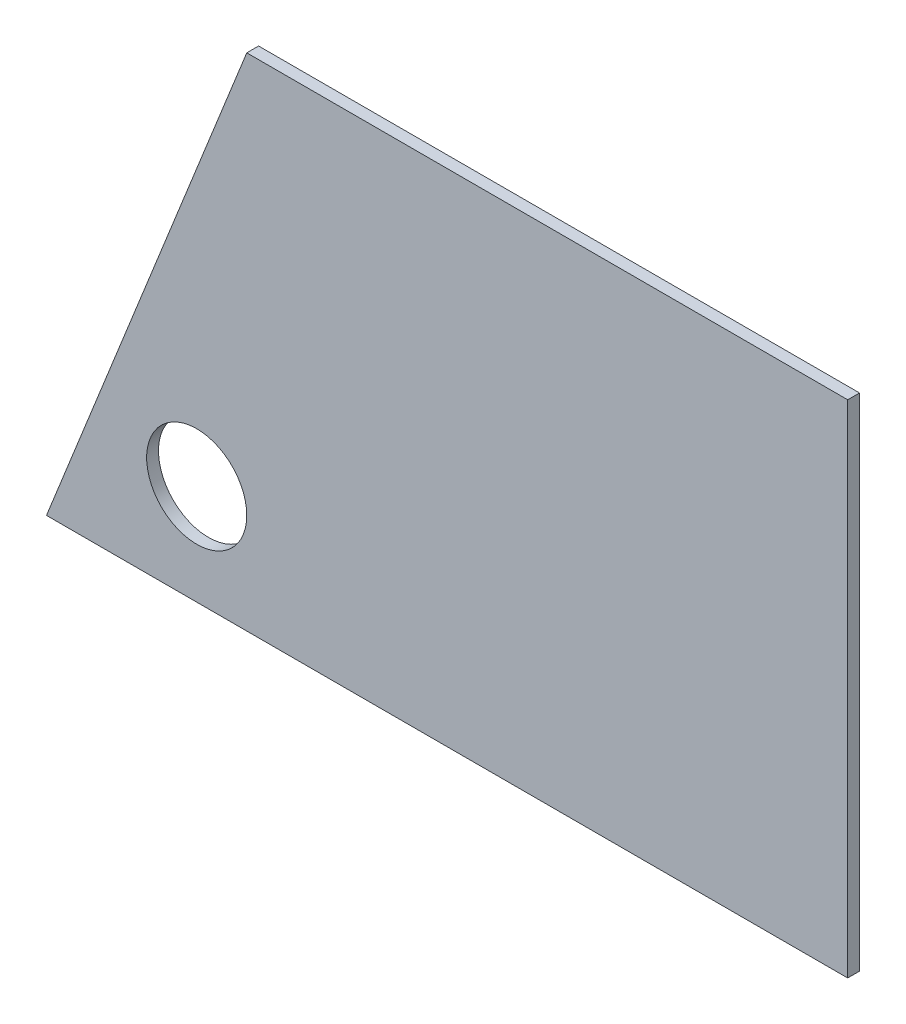
ISO-10303-21;
HEADER;
FILE_DESCRIPTION(('STEP AP214'),'2;1');
FILE_NAME('part.step','',(''),(''),'','','');
FILE_SCHEMA(('AUTOMOTIVE_DESIGN { 1 0 10303 214 1 1 1 1 }'));
ENDSEC;
DATA;
#1=APPLICATION_CONTEXT('core data for automotive mechanical design processes');
#2=APPLICATION_PROTOCOL_DEFINITION('international standard','automotive_design',2000,#1);
#3=PRODUCT_CONTEXT('',#1,'mechanical');
#4=PRODUCT('Part','Part','',(#3));
#5=PRODUCT_RELATED_PRODUCT_CATEGORY('part','',(#4));
#6=PRODUCT_DEFINITION_FORMATION('','',#4);
#7=PRODUCT_DEFINITION_CONTEXT('part definition',#1,'design');
#8=PRODUCT_DEFINITION('design','',#6,#7);
#9=PRODUCT_DEFINITION_SHAPE('','',#8);
#10=(LENGTH_UNIT() NAMED_UNIT(*) SI_UNIT(.MILLI.,.METRE.));
#11=(NAMED_UNIT(*) PLANE_ANGLE_UNIT() SI_UNIT($,.RADIAN.));
#12=(NAMED_UNIT(*) SI_UNIT($,.STERADIAN.) SOLID_ANGLE_UNIT());
#13=UNCERTAINTY_MEASURE_WITH_UNIT(LENGTH_MEASURE(1.E-05),#10,'distance_accuracy_value','');
#14=(GEOMETRIC_REPRESENTATION_CONTEXT(3) GLOBAL_UNCERTAINTY_ASSIGNED_CONTEXT((#13)) GLOBAL_UNIT_ASSIGNED_CONTEXT((#10,
#11,#12)) REPRESENTATION_CONTEXT('',''));
#15=CARTESIAN_POINT('',(0.,0.,0.));
#16=DIRECTION('',(0.,0.,1.));
#17=DIRECTION('',(1.,0.,0.));
#18=AXIS2_PLACEMENT_3D('',#15,#16,#17);
#19=CARTESIAN_POINT('',(0.,0.,3.));
#20=DIRECTION('',(0.928476690885259,-0.371390676354104,0.));
#21=DIRECTION('',(0.371390676354104,0.928476690885259,0.));
#22=AXIS2_PLACEMENT_3D('',#19,#20,#21);
#23=PLANE('',#22);
#24=DIRECTION('',(-0.371390676354104,-0.928476690885259,0.));
#25=VECTOR('',#24,1.);
#26=CARTESIAN_POINT('',(0.,0.,0.));
#27=LINE('',#26,#25);
#28=CARTESIAN_POINT('',(50.8,127.,0.));
#29=VERTEX_POINT('',#28);
#30=CARTESIAN_POINT('',(0.,0.,0.));
#31=VERTEX_POINT('',#30);
#32=EDGE_CURVE('E106',#29,#31,#27,.T.);
#33=ORIENTED_EDGE('',*,*,#32,.T.);
#34=DIRECTION('',(0.,0.,-1.));
#35=VECTOR('',#34,1.);
#36=CARTESIAN_POINT('',(0.,0.,3.));
#37=LINE('',#36,#35);
#38=CARTESIAN_POINT('',(0.,0.,3.));
#39=VERTEX_POINT('',#38);
#40=EDGE_CURVE('E11',#39,#31,#37,.T.);
#41=ORIENTED_EDGE('',*,*,#40,.F.);
#42=DIRECTION('',(-0.371390676354104,-0.928476690885259,0.));
#43=VECTOR('',#42,1.);
#44=CARTESIAN_POINT('',(0.,0.,3.));
#45=LINE('',#44,#43);
#46=CARTESIAN_POINT('',(50.8,127.,3.));
#47=VERTEX_POINT('',#46);
#48=EDGE_CURVE('E91',#47,#39,#45,.T.);
#49=ORIENTED_EDGE('',*,*,#48,.F.);
#50=DIRECTION('',(0.,0.,-1.));
#51=VECTOR('',#50,1.);
#52=CARTESIAN_POINT('',(50.8,127.,3.));
#53=LINE('',#52,#51);
#54=EDGE_CURVE('E105',#47,#29,#53,.T.);
#55=ORIENTED_EDGE('',*,*,#54,.T.);
#56=EDGE_LOOP('',(#33,#41,#49,#55));
#57=FACE_BOUND('',#56,.T.);
#58=ADVANCED_FACE('F39',(#57),#23,.F.);
#59=CARTESIAN_POINT('',(0.,0.,3.));
#60=DIRECTION('',(0.,1.,0.));
#61=DIRECTION('',(0.,0.,1.));
#62=AXIS2_PLACEMENT_3D('',#59,#60,#61);
#63=PLANE('',#62);
#64=DIRECTION('',(1.,0.,0.));
#65=VECTOR('',#64,1.);
#66=CARTESIAN_POINT('',(0.,0.,0.));
#67=LINE('',#66,#65);
#68=CARTESIAN_POINT('',(203.2,0.,0.));
#69=VERTEX_POINT('',#68);
#70=EDGE_CURVE('E95',#31,#69,#67,.T.);
#71=ORIENTED_EDGE('',*,*,#70,.T.);
#72=DIRECTION('',(0.,0.,-1.));
#73=VECTOR('',#72,1.);
#74=CARTESIAN_POINT('',(203.2,0.,3.));
#75=LINE('',#74,#73);
#76=CARTESIAN_POINT('',(203.2,0.,3.));
#77=VERTEX_POINT('',#76);
#78=EDGE_CURVE('E47',#77,#69,#75,.T.);
#79=ORIENTED_EDGE('',*,*,#78,.F.);
#80=DIRECTION('',(1.,0.,0.));
#81=VECTOR('',#80,1.);
#82=CARTESIAN_POINT('',(0.,0.,3.));
#83=LINE('',#82,#81);
#84=EDGE_CURVE('E85',#39,#77,#83,.T.);
#85=ORIENTED_EDGE('',*,*,#84,.F.);
#86=ORIENTED_EDGE('',*,*,#40,.T.);
#87=EDGE_LOOP('',(#71,#79,#85,#86));
#88=FACE_BOUND('',#87,.T.);
#89=ADVANCED_FACE('F94',(#88),#63,.F.);
#90=CARTESIAN_POINT('',(203.2,0.,3.));
#91=DIRECTION('',(-1.,0.,0.));
#92=DIRECTION('',(0.,0.,1.));
#93=AXIS2_PLACEMENT_3D('',#90,#91,#92);
#94=PLANE('',#93);
#95=DIRECTION('',(0.,1.,0.));
#96=VECTOR('',#95,1.);
#97=CARTESIAN_POINT('',(203.2,0.,0.));
#98=LINE('',#97,#96);
#99=CARTESIAN_POINT('',(203.2,127.,0.));
#100=VERTEX_POINT('',#99);
#101=EDGE_CURVE('E72',#69,#100,#98,.T.);
#102=ORIENTED_EDGE('',*,*,#101,.T.);
#103=DIRECTION('',(0.,0.,-1.));
#104=VECTOR('',#103,1.);
#105=CARTESIAN_POINT('',(203.2,127.,3.));
#106=LINE('',#105,#104);
#107=CARTESIAN_POINT('',(203.2,127.,3.));
#108=VERTEX_POINT('',#107);
#109=EDGE_CURVE('E96',#108,#100,#106,.T.);
#110=ORIENTED_EDGE('',*,*,#109,.F.);
#111=DIRECTION('',(0.,1.,0.));
#112=VECTOR('',#111,1.);
#113=CARTESIAN_POINT('',(203.2,0.,3.));
#114=LINE('',#113,#112);
#115=EDGE_CURVE('E89',#77,#108,#114,.T.);
#116=ORIENTED_EDGE('',*,*,#115,.F.);
#117=ORIENTED_EDGE('',*,*,#78,.T.);
#118=EDGE_LOOP('',(#102,#110,#116,#117));
#119=FACE_BOUND('',#118,.T.);
#120=ADVANCED_FACE('F97',(#119),#94,.F.);
#121=CARTESIAN_POINT('',(0.,127.,3.));
#122=DIRECTION('',(0.,-1.,0.));
#123=DIRECTION('',(1.,0.,0.));
#124=AXIS2_PLACEMENT_3D('',#121,#122,#123);
#125=PLANE('',#124);
#126=DIRECTION('',(-1.,0.,0.));
#127=VECTOR('',#126,1.);
#128=CARTESIAN_POINT('',(0.,127.,0.));
#129=LINE('',#128,#127);
#130=EDGE_CURVE('E78',#100,#29,#129,.T.);
#131=ORIENTED_EDGE('',*,*,#130,.T.);
#132=ORIENTED_EDGE('',*,*,#54,.F.);
#133=DIRECTION('',(-1.,0.,0.));
#134=VECTOR('',#133,1.);
#135=CARTESIAN_POINT('',(0.,127.,3.));
#136=LINE('',#135,#134);
#137=EDGE_CURVE('E55',#108,#47,#136,.T.);
#138=ORIENTED_EDGE('',*,*,#137,.F.);
#139=ORIENTED_EDGE('',*,*,#109,.T.);
#140=EDGE_LOOP('',(#131,#132,#138,#139));
#141=FACE_BOUND('',#140,.T.);
#142=ADVANCED_FACE('F116',(#141),#125,.F.);
#143=CARTESIAN_POINT('',(38.1,25.4,3.));
#144=DIRECTION('',(0.,0.,-1.));
#145=DIRECTION('',(-1.,0.,0.));
#146=AXIS2_PLACEMENT_3D('',#143,#144,#145);
#147=CYLINDRICAL_SURFACE('',#146,12.693936535378);
#148=CARTESIAN_POINT('',(38.1,25.4,3.));
#149=DIRECTION('',(0.,0.,1.));
#150=DIRECTION('',(1.,0.,0.));
#151=AXIS2_PLACEMENT_3D('',#148,#149,#150);
#152=CIRCLE('',#151,12.693936535378);
#153=CARTESIAN_POINT('',(50.793936535378,25.4,3.));
#154=VERTEX_POINT('',#153);
#155=EDGE_CURVE('E99',#154,#154,#152,.T.);
#156=ORIENTED_EDGE('',*,*,#155,.T.);
#157=EDGE_LOOP('',(#156));
#158=FACE_BOUND('',#157,.T.);
#159=CARTESIAN_POINT('',(38.1,25.4,0.));
#160=DIRECTION('',(0.,0.,1.));
#161=DIRECTION('',(1.,0.,0.));
#162=AXIS2_PLACEMENT_3D('',#159,#160,#161);
#163=CIRCLE('',#162,12.693936535378);
#164=CARTESIAN_POINT('',(50.793936535378,25.4,0.));
#165=VERTEX_POINT('',#164);
#166=EDGE_CURVE('E112',#165,#165,#163,.T.);
#167=ORIENTED_EDGE('',*,*,#166,.F.);
#168=EDGE_LOOP('',(#167));
#169=FACE_BOUND('',#168,.T.);
#170=ADVANCED_FACE('F133',(#158,#169),#147,.F.);
#171=CARTESIAN_POINT('',(0.,0.,3.));
#172=DIRECTION('',(0.,0.,1.));
#173=DIRECTION('',(1.,0.,0.));
#174=AXIS2_PLACEMENT_3D('',#171,#172,#173);
#175=PLANE('',#174);
#176=ORIENTED_EDGE('',*,*,#48,.T.);
#177=ORIENTED_EDGE('',*,*,#84,.T.);
#178=ORIENTED_EDGE('',*,*,#115,.T.);
#179=ORIENTED_EDGE('',*,*,#137,.T.);
#180=EDGE_LOOP('',(#176,#177,#178,#179));
#181=FACE_BOUND('',#180,.T.);
#182=ORIENTED_EDGE('',*,*,#155,.F.);
#183=EDGE_LOOP('',(#182));
#184=FACE_BOUND('',#183,.T.);
#185=ADVANCED_FACE('F86',(#181,#184),#175,.T.);
#186=CARTESIAN_POINT('',(0.,0.,0.));
#187=DIRECTION('',(0.,0.,1.));
#188=DIRECTION('',(1.,0.,0.));
#189=AXIS2_PLACEMENT_3D('',#186,#187,#188);
#190=PLANE('',#189);
#191=ORIENTED_EDGE('',*,*,#32,.F.);
#192=ORIENTED_EDGE('',*,*,#130,.F.);
#193=ORIENTED_EDGE('',*,*,#101,.F.);
#194=ORIENTED_EDGE('',*,*,#70,.F.);
#195=EDGE_LOOP('',(#191,#192,#193,#194));
#196=FACE_BOUND('',#195,.T.);
#197=ORIENTED_EDGE('',*,*,#166,.T.);
#198=EDGE_LOOP('',(#197));
#199=FACE_BOUND('',#198,.T.);
#200=ADVANCED_FACE('F119',(#196,#199),#190,.F.);
#201=CLOSED_SHELL('',(#58,#89,#120,#142,#170,#185,#200));
#202=MANIFOLD_SOLID_BREP('B2',#201);
#203=ADVANCED_BREP_SHAPE_REPRESENTATION('',(#18,#202),#14);
#204=SHAPE_DEFINITION_REPRESENTATION(#9,#203);
ENDSEC;
END-ISO-10303-21;
